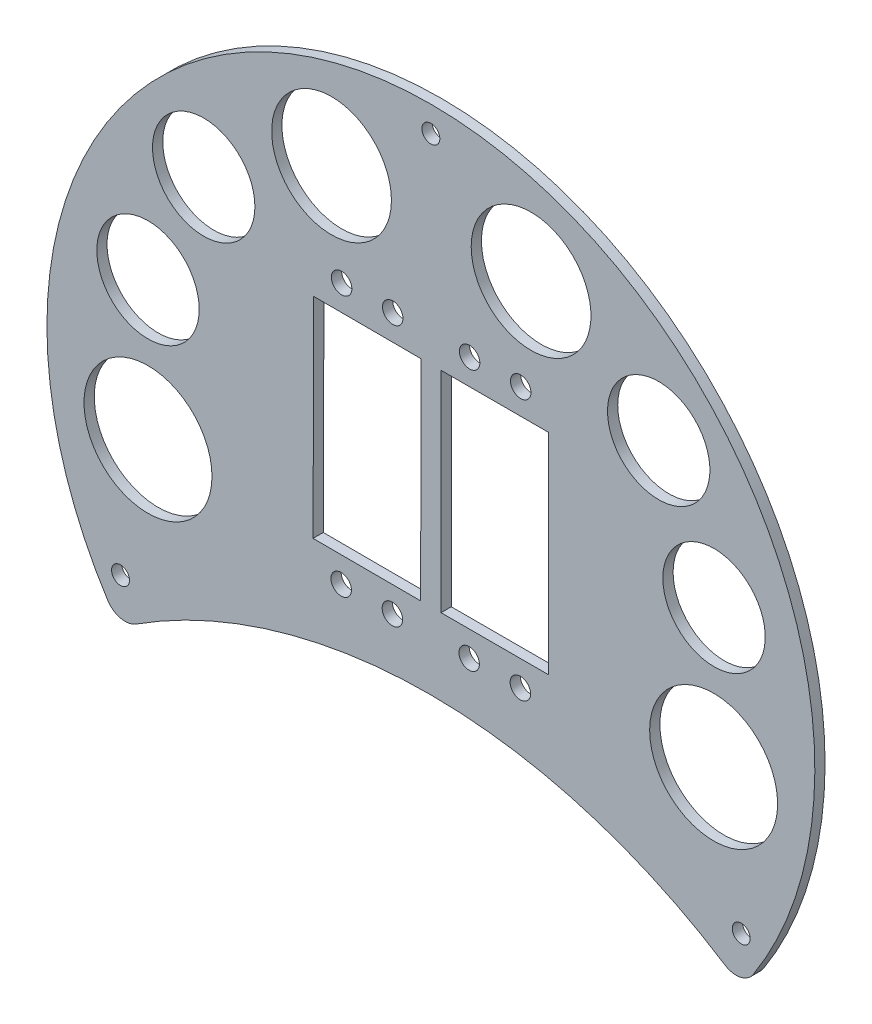
ISO-10303-21;
HEADER;
FILE_DESCRIPTION(('STEP AP214'),'2;1');
FILE_NAME('part.step','',(''),(''),'','','');
FILE_SCHEMA(('AUTOMOTIVE_DESIGN { 1 0 10303 214 1 1 1 1 }'));
ENDSEC;
DATA;
#1=APPLICATION_CONTEXT('core data for automotive mechanical design processes');
#2=APPLICATION_PROTOCOL_DEFINITION('international standard','automotive_design',2000,#1);
#3=PRODUCT_CONTEXT('',#1,'mechanical');
#4=PRODUCT('Part','Part','',(#3));
#5=PRODUCT_RELATED_PRODUCT_CATEGORY('part','',(#4));
#6=PRODUCT_DEFINITION_FORMATION('','',#4);
#7=PRODUCT_DEFINITION_CONTEXT('part definition',#1,'design');
#8=PRODUCT_DEFINITION('design','',#6,#7);
#9=PRODUCT_DEFINITION_SHAPE('','',#8);
#10=(LENGTH_UNIT() NAMED_UNIT(*) SI_UNIT(.MILLI.,.METRE.));
#11=(NAMED_UNIT(*) PLANE_ANGLE_UNIT() SI_UNIT($,.RADIAN.));
#12=(NAMED_UNIT(*) SI_UNIT($,.STERADIAN.) SOLID_ANGLE_UNIT());
#13=UNCERTAINTY_MEASURE_WITH_UNIT(LENGTH_MEASURE(1.E-05),#10,'distance_accuracy_value','');
#14=(GEOMETRIC_REPRESENTATION_CONTEXT(3) GLOBAL_UNCERTAINTY_ASSIGNED_CONTEXT((#13)) GLOBAL_UNIT_ASSIGNED_CONTEXT((#10,
#11,#12)) REPRESENTATION_CONTEXT('',''));
#15=CARTESIAN_POINT('',(0.,0.,0.));
#16=DIRECTION('',(0.,0.,1.));
#17=DIRECTION('',(1.,0.,0.));
#18=AXIS2_PLACEMENT_3D('',#15,#16,#17);
#19=CARTESIAN_POINT('',(-0.0987429554995067,-65.6598623126236,2.));
#20=DIRECTION('',(0.,0.,-1.));
#21=DIRECTION('',(-1.,0.,0.));
#22=AXIS2_PLACEMENT_3D('',#19,#20,#21);
#23=PLANE('',#22);
#24=CARTESIAN_POINT('',(17.4774003218336,-15.0409827319242,2.));
#25=DIRECTION('',(0.,0.,1.));
#26=DIRECTION('',(1.,0.,0.));
#27=AXIS2_PLACEMENT_3D('',#24,#25,#26);
#28=CIRCLE('',#27,2.);
#29=CARTESIAN_POINT('',(19.4774003218336,-15.0409827319242,2.));
#30=VERTEX_POINT('',#29);
#31=EDGE_CURVE('E404',#30,#30,#28,.T.);
#32=ORIENTED_EDGE('',*,*,#31,.F.);
#33=EDGE_LOOP('',(#32));
#34=FACE_BOUND('',#33,.T.);
#35=CARTESIAN_POINT('',(7.56186671963432,35.9740324724245,2.));
#36=DIRECTION('',(0.,0.,1.));
#37=DIRECTION('',(1.,0.,0.));
#38=AXIS2_PLACEMENT_3D('',#35,#36,#37);
#39=CIRCLE('',#38,2.00000000000208);
#40=CARTESIAN_POINT('',(9.5618667196364,35.9740324724245,2.));
#41=VERTEX_POINT('',#40);
#42=EDGE_CURVE('E151',#41,#41,#39,.F.);
#43=ORIENTED_EDGE('',*,*,#42,.T.);
#44=EDGE_LOOP('',(#43));
#45=FACE_BOUND('',#44,.T.);
#46=DIRECTION('',(-0.00300770451557121,-0.999995476846544,0.));
#47=VECTOR('',#46,1.);
#48=CARTESIAN_POINT('',(-1.98490496810612,0.00597003463893531,2.));
#49=LINE('',#48,#47);
#50=CARTESIAN_POINT('',(-1.89178939207128,30.9648472703288,2.));
#51=VERTEX_POINT('',#50);
#52=CARTESIAN_POINT('',(-2.0151052772097,-10.0349672803795,2.));
#53=VERTEX_POINT('',#52);
#54=EDGE_CURVE('E78',#51,#53,#49,.T.);
#55=ORIENTED_EDGE('',*,*,#54,.T.);
#56=DIRECTION('',(-0.999995476846544,0.00300770451557127,0.));
#57=VECTOR('',#56,1.);
#58=CARTESIAN_POINT('',(-0.0302003091035815,-10.0409373150184,2.));
#59=LINE('',#58,#57);
#60=CARTESIAN_POINT('',(-23.0150102909871,-9.97180548555249,2.));
#61=VERTEX_POINT('',#60);
#62=EDGE_CURVE('E189',#53,#61,#59,.T.);
#63=ORIENTED_EDGE('',*,*,#62,.T.);
#64=DIRECTION('',(-0.00300770451557121,-0.999995476846544,0.));
#65=VECTOR('',#64,1.);
#66=CARTESIAN_POINT('',(-22.9848099818835,0.0691318294659308,2.));
#67=LINE('',#66,#65);
#68=CARTESIAN_POINT('',(-22.8916944058487,31.0280090651558,2.));
#69=VERTEX_POINT('',#68);
#70=EDGE_CURVE('E185',#69,#61,#67,.T.);
#71=ORIENTED_EDGE('',*,*,#70,.F.);
#72=DIRECTION('',(-0.999995476846544,0.00300770451557119,0.));
#73=VECTOR('',#72,1.);
#74=CARTESIAN_POINT('',(0.0931155760348381,30.9588772356899,2.));
#75=LINE('',#74,#73);
#76=EDGE_CURVE('E172',#51,#69,#75,.T.);
#77=ORIENTED_EDGE('',*,*,#76,.F.);
#78=EDGE_LOOP('',(#55,#63,#71,#77));
#79=FACE_BOUND('',#78,.T.);
#80=CARTESIAN_POINT('',(55.2306988549599,-9.53210745779192,2.));
#81=DIRECTION('',(0.,0.,1.));
#82=DIRECTION('',(-1.,0.,0.));
#83=AXIS2_PLACEMENT_3D('',#80,#81,#82);
#84=CIRCLE('',#83,12.5);
#85=CARTESIAN_POINT('',(42.7306988549599,-9.53210745779192,2.));
#86=VERTEX_POINT('',#85);
#87=EDGE_CURVE('E209',#86,#86,#84,.T.);
#88=ORIENTED_EDGE('',*,*,#87,.F.);
#89=EDGE_LOOP('',(#88));
#90=FACE_BOUND('',#89,.T.);
#91=CARTESIAN_POINT('',(-55.2591188006772,17.6479430745857,2.));
#92=DIRECTION('',(0.,0.,1.));
#93=DIRECTION('',(1.,0.,0.));
#94=AXIS2_PLACEMENT_3D('',#91,#92,#93);
#95=CIRCLE('',#94,10.);
#96=CARTESIAN_POINT('',(-45.2591188006772,17.6479430745857,2.));
#97=VERTEX_POINT('',#96);
#98=EDGE_CURVE('E235',#97,#97,#95,.T.);
#99=ORIENTED_EDGE('',*,*,#98,.F.);
#100=EDGE_LOOP('',(#99));
#101=FACE_BOUND('',#100,.T.);
#102=CARTESIAN_POINT('',(-55.2591188006772,-9.36594672026292,2.));
#103=DIRECTION('',(0.,0.,1.));
#104=DIRECTION('',(1.,0.,0.));
#105=AXIS2_PLACEMENT_3D('',#102,#103,#104);
#106=CIRCLE('',#105,12.5);
#107=CARTESIAN_POINT('',(-42.7591188006772,-9.36594672026292,2.));
#108=VERTEX_POINT('',#107);
#109=EDGE_CURVE('E234',#108,#108,#106,.T.);
#110=ORIENTED_EDGE('',*,*,#109,.F.);
#111=EDGE_LOOP('',(#110));
#112=FACE_BOUND('',#111,.T.);
#113=CARTESIAN_POINT('',(-44.3754777327143,40.4603703322555,2.));
#114=DIRECTION('',(0.,0.,1.));
#115=DIRECTION('',(1.,0.,0.));
#116=AXIS2_PLACEMENT_3D('',#113,#114,#115);
#117=CIRCLE('',#116,10.);
#118=CARTESIAN_POINT('',(-34.3754777327143,40.4603703322555,2.));
#119=VERTEX_POINT('',#118);
#120=EDGE_CURVE('E251',#119,#119,#117,.T.);
#121=ORIENTED_EDGE('',*,*,#120,.F.);
#122=EDGE_LOOP('',(#121));
#123=FACE_BOUND('',#122,.T.);
#124=CARTESIAN_POINT('',(55.311948653279,17.4816601490877,2.));
#125=DIRECTION('',(0.,0.,1.));
#126=DIRECTION('',(-1.,0.,0.));
#127=AXIS2_PLACEMENT_3D('',#124,#125,#126);
#128=CIRCLE('',#127,10.);
#129=CARTESIAN_POINT('',(45.311948653279,17.4816601490877,2.));
#130=VERTEX_POINT('',#129);
#131=EDGE_CURVE('E210',#130,#130,#128,.T.);
#132=ORIENTED_EDGE('',*,*,#131,.F.);
#133=EDGE_LOOP('',(#132));
#134=FACE_BOUND('',#133,.T.);
#135=CARTESIAN_POINT('',(44.4969698541689,40.3267189990343,2.));
#136=DIRECTION('',(0.,0.,1.));
#137=DIRECTION('',(-1.,0.,0.));
#138=AXIS2_PLACEMENT_3D('',#135,#136,#137);
#139=CIRCLE('',#138,10.);
#140=CARTESIAN_POINT('',(34.4969698541689,40.3267189990343,2.));
#141=VERTEX_POINT('',#140);
#142=EDGE_CURVE('E218',#141,#141,#139,.T.);
#143=ORIENTED_EDGE('',*,*,#142,.F.);
#144=EDGE_LOOP('',(#143));
#145=FACE_BOUND('',#144,.T.);
#146=CARTESIAN_POINT('',(19.5694490750945,54.8142071950898,2.));
#147=DIRECTION('',(0.,0.,1.));
#148=DIRECTION('',(-1.,0.,0.));
#149=AXIS2_PLACEMENT_3D('',#146,#147,#148);
#150=CIRCLE('',#149,11.69783551895);
#151=CARTESIAN_POINT('',(7.87161355614443,54.8142071950898,2.));
#152=VERTEX_POINT('',#151);
#153=EDGE_CURVE('E226',#152,#152,#150,.T.);
#154=ORIENTED_EDGE('',*,*,#153,.F.);
#155=EDGE_LOOP('',(#154));
#156=FACE_BOUND('',#155,.T.);
#157=CARTESIAN_POINT('',(-19.4044956209751,54.8728183823695,2.));
#158=DIRECTION('',(0.,0.,1.));
#159=DIRECTION('',(1.,0.,0.));
#160=AXIS2_PLACEMENT_3D('',#157,#158,#159);
#161=CIRCLE('',#160,11.69783551895);
#162=CARTESIAN_POINT('',(-7.70666010202509,54.8728183823695,2.));
#163=VERTEX_POINT('',#162);
#164=EDGE_CURVE('E250',#163,#163,#161,.T.);
#165=ORIENTED_EDGE('',*,*,#164,.F.);
#166=EDGE_LOOP('',(#165));
#167=FACE_BOUND('',#166,.T.);
#168=CARTESIAN_POINT('',(0.,70.,2.));
#169=DIRECTION('',(0.,0.,1.));
#170=DIRECTION('',(1.,0.,0.));
#171=AXIS2_PLACEMENT_3D('',#168,#169,#170);
#172=CIRCLE('',#171,1.75);
#173=CARTESIAN_POINT('',(1.75,70.,2.));
#174=VERTEX_POINT('',#173);
#175=EDGE_CURVE('E275',#174,#174,#172,.T.);
#176=ORIENTED_EDGE('',*,*,#175,.F.);
#177=EDGE_LOOP('',(#176));
#178=FACE_BOUND('',#177,.T.);
#179=CARTESIAN_POINT('',(60.6217782649137,-34.9999999999983,2.));
#180=DIRECTION('',(0.,0.,1.));
#181=DIRECTION('',(1.,0.,0.));
#182=AXIS2_PLACEMENT_3D('',#179,#180,#181);
#183=CIRCLE('',#182,1.74999999999999);
#184=CARTESIAN_POINT('',(62.3717782649137,-34.9999999999983,2.));
#185=VERTEX_POINT('',#184);
#186=EDGE_CURVE('E283',#185,#185,#183,.T.);
#187=ORIENTED_EDGE('',*,*,#186,.F.);
#188=EDGE_LOOP('',(#187));
#189=FACE_BOUND('',#188,.T.);
#190=CARTESIAN_POINT('',(-60.6217782649077,-35.0000000000018,2.));
#191=DIRECTION('',(0.,0.,1.));
#192=DIRECTION('',(1.,0.,0.));
#193=AXIS2_PLACEMENT_3D('',#190,#191,#192);
#194=CIRCLE('',#193,1.75);
#195=CARTESIAN_POINT('',(-58.8717782649077,-35.0000000000018,2.));
#196=VERTEX_POINT('',#195);
#197=EDGE_CURVE('E266',#196,#196,#194,.T.);
#198=ORIENTED_EDGE('',*,*,#197,.F.);
#199=EDGE_LOOP('',(#198));
#200=FACE_BOUND('',#199,.T.);
#201=CARTESIAN_POINT('',(-0.197485910999013,-131.319724625247,2.));
#202=DIRECTION('',(0.,0.,-1.));
#203=DIRECTION('',(-1.,0.,0.));
#204=AXIS2_PLACEMENT_3D('',#201,#202,#203);
#205=CIRCLE('',#204,106.376248591032);
#206=CARTESIAN_POINT('',(-57.576659184096,-41.7455277893448,2.));
#207=VERTEX_POINT('',#206);
#208=CARTESIAN_POINT('',(57.4508405435942,-41.9185125457361,2.));
#209=VERTEX_POINT('',#208);
#210=EDGE_CURVE('E294',#207,#209,#205,.T.);
#211=ORIENTED_EDGE('',*,*,#210,.T.);
#212=CARTESIAN_POINT('',(59.6185547549206,-38.556814299609,2.));
#213=DIRECTION('',(0.,0.,-1.));
#214=DIRECTION('',(-1.,0.,0.));
#215=AXIS2_PLACEMENT_3D('',#212,#213,#214);
#216=CIRCLE('',#215,4.);
#217=CARTESIAN_POINT('',(62.9773465720992,-40.7290291897278,2.));
#218=VERTEX_POINT('',#217);
#219=EDGE_CURVE('E332',#209,#218,#216,.F.);
#220=ORIENTED_EDGE('',*,*,#219,.T.);
#221=CARTESIAN_POINT('',(0.,0.,2.));
#222=DIRECTION('',(0.,0.,1.));
#223=DIRECTION('',(1.,0.,0.));
#224=AXIS2_PLACEMENT_3D('',#221,#222,#223);
#225=CIRCLE('',#224,75.);
#226=CARTESIAN_POINT('',(-63.0995626009052,-40.5394277164151,2.));
#227=VERTEX_POINT('',#226);
#228=EDGE_CURVE('E298',#218,#227,#225,.T.);
#229=ORIENTED_EDGE('',*,*,#228,.T.);
#230=CARTESIAN_POINT('',(-59.7342525955236,-38.3773249048729,2.));
#231=DIRECTION('',(0.,0.,-1.));
#232=DIRECTION('',(-1.,0.,0.));
#233=AXIS2_PLACEMENT_3D('',#230,#231,#232);
#234=CIRCLE('',#233,4.);
#235=EDGE_CURVE('E329',#227,#207,#234,.F.);
#236=ORIENTED_EDGE('',*,*,#235,.T.);
#237=EDGE_LOOP('',(#211,#220,#229,#236));
#238=FACE_BOUND('',#237,.T.);
#239=CARTESIAN_POINT('',(-7.52257140844136,-15.003386382966,2.));
#240=DIRECTION('',(0.,0.,1.));
#241=DIRECTION('',(1.,0.,0.));
#242=AXIS2_PLACEMENT_3D('',#239,#240,#241);
#243=CIRCLE('',#242,2.);
#244=CARTESIAN_POINT('',(-5.52257140844136,-15.003386382966,2.));
#245=VERTEX_POINT('',#244);
#246=EDGE_CURVE('E405',#245,#245,#243,.T.);
#247=ORIENTED_EDGE('',*,*,#246,.F.);
#248=EDGE_LOOP('',(#247));
#249=FACE_BOUND('',#248,.T.);
#250=CARTESIAN_POINT('',(-7.45363325624011,35.996613617034,2.));
#251=DIRECTION('',(0.,0.,1.));
#252=DIRECTION('',(1.,0.,0.));
#253=AXIS2_PLACEMENT_3D('',#250,#251,#252);
#254=CIRCLE('',#253,1.99999999999792);
#255=CARTESIAN_POINT('',(-5.45363325624219,35.996613617034,2.));
#256=VERTEX_POINT('',#255);
#257=EDGE_CURVE('E419',#256,#256,#254,.T.);
#258=ORIENTED_EDGE('',*,*,#257,.F.);
#259=EDGE_LOOP('',(#258));
#260=FACE_BOUND('',#259,.T.);
#261=CARTESIAN_POINT('',(17.5463384740348,35.9590172680758,2.));
#262=DIRECTION('',(0.,0.,1.));
#263=DIRECTION('',(1.,0.,0.));
#264=AXIS2_PLACEMENT_3D('',#261,#262,#263);
#265=CIRCLE('',#264,1.99999999999792);
#266=CARTESIAN_POINT('',(19.5463384740327,35.9590172680758,2.));
#267=VERTEX_POINT('',#266);
#268=EDGE_CURVE('E180',#267,#267,#265,.T.);
#269=ORIENTED_EDGE('',*,*,#268,.F.);
#270=EDGE_LOOP('',(#269));
#271=FACE_BOUND('',#270,.T.);
#272=DIRECTION('',(0.,-1.,0.));
#273=VECTOR('',#272,1.);
#274=CARTESIAN_POINT('',(22.9849139461765,0.,2.));
#275=LINE('',#274,#273);
#276=CARTESIAN_POINT('',(22.9849139461765,30.9590172680758,2.));
#277=VERTEX_POINT('',#276);
#278=CARTESIAN_POINT('',(22.9849139461765,-10.0409827319242,2.));
#279=VERTEX_POINT('',#278);
#280=EDGE_CURVE('E70',#277,#279,#275,.T.);
#281=ORIENTED_EDGE('',*,*,#280,.T.);
#282=DIRECTION('',(1.,0.,0.));
#283=VECTOR('',#282,1.);
#284=CARTESIAN_POINT('',(0.,-10.0409827319242,2.));
#285=LINE('',#284,#283);
#286=CARTESIAN_POINT('',(1.9849139461765,-10.0409827319242,2.));
#287=VERTEX_POINT('',#286);
#288=EDGE_CURVE('E154',#287,#279,#285,.T.);
#289=ORIENTED_EDGE('',*,*,#288,.F.);
#290=DIRECTION('',(0.,-1.,0.));
#291=VECTOR('',#290,1.);
#292=CARTESIAN_POINT('',(1.9849139461765,0.,2.));
#293=LINE('',#292,#291);
#294=CARTESIAN_POINT('',(1.9849139461765,30.9590172680758,2.));
#295=VERTEX_POINT('',#294);
#296=EDGE_CURVE('E161',#295,#287,#293,.T.);
#297=ORIENTED_EDGE('',*,*,#296,.F.);
#298=DIRECTION('',(1.,0.,0.));
#299=VECTOR('',#298,1.);
#300=CARTESIAN_POINT('',(0.,30.9590172680758,2.));
#301=LINE('',#300,#299);
#302=EDGE_CURVE('E167',#295,#277,#301,.T.);
#303=ORIENTED_EDGE('',*,*,#302,.T.);
#304=EDGE_LOOP('',(#281,#289,#297,#303));
#305=FACE_BOUND('',#304,.T.);
#306=CARTESIAN_POINT('',(-17.4381050106406,36.0116288213827,2.));
#307=DIRECTION('',(0.,0.,1.));
#308=DIRECTION('',(1.,0.,0.));
#309=AXIS2_PLACEMENT_3D('',#306,#307,#308);
#310=CIRCLE('',#309,2.00000000000209);
#311=CARTESIAN_POINT('',(-15.4381050106385,36.0116288213827,2.));
#312=VERTEX_POINT('',#311);
#313=EDGE_CURVE('E423',#312,#312,#310,.F.);
#314=ORIENTED_EDGE('',*,*,#313,.T.);
#315=EDGE_LOOP('',(#314));
#316=FACE_BOUND('',#315,.T.);
#317=CARTESIAN_POINT('',(-17.5225601005513,-14.9883478433827,2.));
#318=DIRECTION('',(0.,0.,1.));
#319=DIRECTION('',(1.,0.,0.));
#320=AXIS2_PLACEMENT_3D('',#317,#318,#319);
#321=CIRCLE('',#320,2.);
#322=CARTESIAN_POINT('',(-15.5225601005513,-14.9883478433827,2.));
#323=VERTEX_POINT('',#322);
#324=EDGE_CURVE('E409',#323,#323,#321,.F.);
#325=ORIENTED_EDGE('',*,*,#324,.T.);
#326=EDGE_LOOP('',(#325));
#327=FACE_BOUND('',#326,.T.);
#328=CARTESIAN_POINT('',(7.47741162972359,-15.0259441923409,2.));
#329=DIRECTION('',(0.,0.,1.));
#330=DIRECTION('',(1.,0.,0.));
#331=AXIS2_PLACEMENT_3D('',#328,#329,#330);
#332=CIRCLE('',#331,2.);
#333=CARTESIAN_POINT('',(9.47741162972359,-15.0259441923409,2.));
#334=VERTEX_POINT('',#333);
#335=EDGE_CURVE('E401',#334,#334,#332,.F.);
#336=ORIENTED_EDGE('',*,*,#335,.T.);
#337=EDGE_LOOP('',(#336));
#338=FACE_BOUND('',#337,.T.);
#339=ADVANCED_FACE('F52',(#34,#45,#79,#90,#101,#112,#123,#134,#145,#156,#167,#178,#189,#200,
#238,#249,#260,#271,#305,#316,#327,#338),#23,.F.);
#340=CARTESIAN_POINT('',(-0.0987429554995067,-65.6598623126236,0.));
#341=DIRECTION('',(0.,0.,-1.));
#342=DIRECTION('',(-1.,0.,0.));
#343=AXIS2_PLACEMENT_3D('',#340,#341,#342);
#344=PLANE('',#343);
#345=CARTESIAN_POINT('',(-17.5225601005513,-14.9883478433827,0.));
#346=DIRECTION('',(0.,0.,-1.));
#347=DIRECTION('',(-1.,0.,0.));
#348=AXIS2_PLACEMENT_3D('',#345,#346,#347);
#349=CIRCLE('',#348,2.);
#350=CARTESIAN_POINT('',(-19.5225601005513,-14.9883478433827,0.));
#351=VERTEX_POINT('',#350);
#352=EDGE_CURVE('E379',#351,#351,#349,.F.);
#353=ORIENTED_EDGE('',*,*,#352,.T.);
#354=EDGE_LOOP('',(#353));
#355=FACE_BOUND('',#354,.T.);
#356=DIRECTION('',(-1.,0.,0.));
#357=VECTOR('',#356,1.);
#358=CARTESIAN_POINT('',(-0.0987429554995159,-10.0409827319242,0.));
#359=LINE('',#358,#357);
#360=CARTESIAN_POINT('',(22.9849139461765,-10.0409827319242,0.));
#361=VERTEX_POINT('',#360);
#362=CARTESIAN_POINT('',(1.9849139461765,-10.0409827319242,0.));
#363=VERTEX_POINT('',#362);
#364=EDGE_CURVE('E62',#361,#363,#359,.T.);
#365=ORIENTED_EDGE('',*,*,#364,.F.);
#366=DIRECTION('',(0.,1.,0.));
#367=VECTOR('',#366,1.);
#368=CARTESIAN_POINT('',(22.9849139461765,-65.6598623126236,0.));
#369=LINE('',#368,#367);
#370=CARTESIAN_POINT('',(22.9849139461765,30.9590172680758,0.));
#371=VERTEX_POINT('',#370);
#372=EDGE_CURVE('E12',#361,#371,#369,.T.);
#373=ORIENTED_EDGE('',*,*,#372,.T.);
#374=DIRECTION('',(-1.,0.,0.));
#375=VECTOR('',#374,1.);
#376=CARTESIAN_POINT('',(-0.0987429554995227,30.9590172680758,0.));
#377=LINE('',#376,#375);
#378=CARTESIAN_POINT('',(1.9849139461765,30.9590172680758,0.));
#379=VERTEX_POINT('',#378);
#380=EDGE_CURVE('E350',#371,#379,#377,.T.);
#381=ORIENTED_EDGE('',*,*,#380,.T.);
#382=DIRECTION('',(0.,1.,0.));
#383=VECTOR('',#382,1.);
#384=CARTESIAN_POINT('',(1.98491394617651,-65.6598623126236,0.));
#385=LINE('',#384,#383);
#386=EDGE_CURVE('E370',#363,#379,#385,.T.);
#387=ORIENTED_EDGE('',*,*,#386,.F.);
#388=EDGE_LOOP('',(#365,#373,#381,#387));
#389=FACE_BOUND('',#388,.T.);
#390=CARTESIAN_POINT('',(7.56186671963432,35.9740324724245,0.));
#391=DIRECTION('',(0.,0.,-1.));
#392=DIRECTION('',(-1.,0.,0.));
#393=AXIS2_PLACEMENT_3D('',#390,#391,#392);
#394=CIRCLE('',#393,2.00000000000208);
#395=CARTESIAN_POINT('',(5.56186671963224,35.9740324724245,0.));
#396=VERTEX_POINT('',#395);
#397=EDGE_CURVE('E362',#396,#396,#394,.F.);
#398=ORIENTED_EDGE('',*,*,#397,.T.);
#399=EDGE_LOOP('',(#398));
#400=FACE_BOUND('',#399,.T.);
#401=CARTESIAN_POINT('',(17.5463384740348,35.9590172680758,0.));
#402=DIRECTION('',(0.,0.,-1.));
#403=DIRECTION('',(-1.,0.,0.));
#404=AXIS2_PLACEMENT_3D('',#401,#402,#403);
#405=CIRCLE('',#404,1.99999999999792);
#406=CARTESIAN_POINT('',(15.5463384740369,35.9590172680758,0.));
#407=VERTEX_POINT('',#406);
#408=EDGE_CURVE('E358',#407,#407,#405,.T.);
#409=ORIENTED_EDGE('',*,*,#408,.F.);
#410=EDGE_LOOP('',(#409));
#411=FACE_BOUND('',#410,.T.);
#412=CARTESIAN_POINT('',(-7.45363325624011,35.996613617034,0.));
#413=DIRECTION('',(0.,0.,-1.));
#414=DIRECTION('',(-1.,0.,0.));
#415=AXIS2_PLACEMENT_3D('',#412,#413,#414);
#416=CIRCLE('',#415,1.99999999999792);
#417=CARTESIAN_POINT('',(-9.45363325623803,35.996613617034,0.));
#418=VERTEX_POINT('',#417);
#419=EDGE_CURVE('E354',#418,#418,#416,.T.);
#420=ORIENTED_EDGE('',*,*,#419,.F.);
#421=EDGE_LOOP('',(#420));
#422=FACE_BOUND('',#421,.T.);
#423=CARTESIAN_POINT('',(-7.52257140844136,-15.003386382966,0.));
#424=DIRECTION('',(0.,0.,-1.));
#425=DIRECTION('',(-1.,0.,0.));
#426=AXIS2_PLACEMENT_3D('',#423,#424,#425);
#427=CIRCLE('',#426,2.);
#428=CARTESIAN_POINT('',(-9.52257140844136,-15.003386382966,0.));
#429=VERTEX_POINT('',#428);
#430=EDGE_CURVE('E197',#429,#429,#427,.T.);
#431=ORIENTED_EDGE('',*,*,#430,.F.);
#432=EDGE_LOOP('',(#431));
#433=FACE_BOUND('',#432,.T.);
#434=CARTESIAN_POINT('',(55.2306988549599,-9.53210745779192,0.));
#435=DIRECTION('',(0.,0.,1.));
#436=DIRECTION('',(-1.,0.,0.));
#437=AXIS2_PLACEMENT_3D('',#434,#435,#436);
#438=CIRCLE('',#437,12.5);
#439=CARTESIAN_POINT('',(42.7306988549599,-9.53210745779192,0.));
#440=VERTEX_POINT('',#439);
#441=EDGE_CURVE('E239',#440,#440,#438,.T.);
#442=ORIENTED_EDGE('',*,*,#441,.T.);
#443=EDGE_LOOP('',(#442));
#444=FACE_BOUND('',#443,.T.);
#445=CARTESIAN_POINT('',(-55.2591188006772,17.6479430745857,0.));
#446=DIRECTION('',(0.,0.,1.));
#447=DIRECTION('',(1.,0.,0.));
#448=AXIS2_PLACEMENT_3D('',#445,#446,#447);
#449=CIRCLE('',#448,10.);
#450=CARTESIAN_POINT('',(-45.2591188006772,17.6479430745857,0.));
#451=VERTEX_POINT('',#450);
#452=EDGE_CURVE('E230',#451,#451,#449,.T.);
#453=ORIENTED_EDGE('',*,*,#452,.T.);
#454=EDGE_LOOP('',(#453));
#455=FACE_BOUND('',#454,.T.);
#456=CARTESIAN_POINT('',(-55.2591188006772,-9.36594672026292,0.));
#457=DIRECTION('',(0.,0.,1.));
#458=DIRECTION('',(1.,0.,0.));
#459=AXIS2_PLACEMENT_3D('',#456,#457,#458);
#460=CIRCLE('',#459,12.5);
#461=CARTESIAN_POINT('',(-42.7591188006772,-9.36594672026292,0.));
#462=VERTEX_POINT('',#461);
#463=EDGE_CURVE('E255',#462,#462,#460,.T.);
#464=ORIENTED_EDGE('',*,*,#463,.T.);
#465=EDGE_LOOP('',(#464));
#466=FACE_BOUND('',#465,.T.);
#467=CARTESIAN_POINT('',(-44.3754777327143,40.4603703322555,0.));
#468=DIRECTION('',(0.,0.,1.));
#469=DIRECTION('',(1.,0.,0.));
#470=AXIS2_PLACEMENT_3D('',#467,#468,#469);
#471=CIRCLE('',#470,10.);
#472=CARTESIAN_POINT('',(-34.3754777327143,40.4603703322555,0.));
#473=VERTEX_POINT('',#472);
#474=EDGE_CURVE('E246',#473,#473,#471,.T.);
#475=ORIENTED_EDGE('',*,*,#474,.T.);
#476=EDGE_LOOP('',(#475));
#477=FACE_BOUND('',#476,.T.);
#478=CARTESIAN_POINT('',(55.311948653279,17.4816601490877,0.));
#479=DIRECTION('',(0.,0.,1.));
#480=DIRECTION('',(-1.,0.,0.));
#481=AXIS2_PLACEMENT_3D('',#478,#479,#480);
#482=CIRCLE('',#481,10.);
#483=CARTESIAN_POINT('',(45.311948653279,17.4816601490877,0.));
#484=VERTEX_POINT('',#483);
#485=EDGE_CURVE('E205',#484,#484,#482,.T.);
#486=ORIENTED_EDGE('',*,*,#485,.T.);
#487=EDGE_LOOP('',(#486));
#488=FACE_BOUND('',#487,.T.);
#489=CARTESIAN_POINT('',(44.4969698541689,40.3267189990343,0.));
#490=DIRECTION('',(0.,0.,1.));
#491=DIRECTION('',(-1.,0.,0.));
#492=AXIS2_PLACEMENT_3D('',#489,#490,#491);
#493=CIRCLE('',#492,10.);
#494=CARTESIAN_POINT('',(34.4969698541689,40.3267189990343,0.));
#495=VERTEX_POINT('',#494);
#496=EDGE_CURVE('E214',#495,#495,#493,.T.);
#497=ORIENTED_EDGE('',*,*,#496,.T.);
#498=EDGE_LOOP('',(#497));
#499=FACE_BOUND('',#498,.T.);
#500=CARTESIAN_POINT('',(19.5694490750945,54.8142071950898,0.));
#501=DIRECTION('',(0.,0.,1.));
#502=DIRECTION('',(-1.,0.,0.));
#503=AXIS2_PLACEMENT_3D('',#500,#501,#502);
#504=CIRCLE('',#503,11.69783551895);
#505=CARTESIAN_POINT('',(7.87161355614443,54.8142071950898,0.));
#506=VERTEX_POINT('',#505);
#507=EDGE_CURVE('E222',#506,#506,#504,.T.);
#508=ORIENTED_EDGE('',*,*,#507,.T.);
#509=EDGE_LOOP('',(#508));
#510=FACE_BOUND('',#509,.T.);
#511=CARTESIAN_POINT('',(-19.4044956209751,54.8728183823695,0.));
#512=DIRECTION('',(0.,0.,1.));
#513=DIRECTION('',(1.,0.,0.));
#514=AXIS2_PLACEMENT_3D('',#511,#512,#513);
#515=CIRCLE('',#514,11.69783551895);
#516=CARTESIAN_POINT('',(-7.70666010202509,54.8728183823695,0.));
#517=VERTEX_POINT('',#516);
#518=EDGE_CURVE('E262',#517,#517,#515,.T.);
#519=ORIENTED_EDGE('',*,*,#518,.T.);
#520=EDGE_LOOP('',(#519));
#521=FACE_BOUND('',#520,.T.);
#522=CARTESIAN_POINT('',(0.,70.,0.));
#523=DIRECTION('',(0.,0.,1.));
#524=DIRECTION('',(1.,0.,0.));
#525=AXIS2_PLACEMENT_3D('',#522,#523,#524);
#526=CIRCLE('',#525,1.75);
#527=CARTESIAN_POINT('',(1.75,70.,0.));
#528=VERTEX_POINT('',#527);
#529=EDGE_CURVE('E270',#528,#528,#526,.T.);
#530=ORIENTED_EDGE('',*,*,#529,.T.);
#531=EDGE_LOOP('',(#530));
#532=FACE_BOUND('',#531,.T.);
#533=CARTESIAN_POINT('',(60.6217782649137,-34.9999999999983,0.));
#534=DIRECTION('',(0.,0.,1.));
#535=DIRECTION('',(1.,0.,0.));
#536=AXIS2_PLACEMENT_3D('',#533,#534,#535);
#537=CIRCLE('',#536,1.74999999999999);
#538=CARTESIAN_POINT('',(62.3717782649137,-34.9999999999983,0.));
#539=VERTEX_POINT('',#538);
#540=EDGE_CURVE('E279',#539,#539,#537,.T.);
#541=ORIENTED_EDGE('',*,*,#540,.T.);
#542=EDGE_LOOP('',(#541));
#543=FACE_BOUND('',#542,.T.);
#544=CARTESIAN_POINT('',(-60.6217782649077,-35.0000000000018,0.));
#545=DIRECTION('',(0.,0.,1.));
#546=DIRECTION('',(1.,0.,0.));
#547=AXIS2_PLACEMENT_3D('',#544,#545,#546);
#548=CIRCLE('',#547,1.75);
#549=CARTESIAN_POINT('',(-58.8717782649077,-35.0000000000018,0.));
#550=VERTEX_POINT('',#549);
#551=EDGE_CURVE('E287',#550,#550,#548,.T.);
#552=ORIENTED_EDGE('',*,*,#551,.T.);
#553=EDGE_LOOP('',(#552));
#554=FACE_BOUND('',#553,.T.);
#555=CARTESIAN_POINT('',(0.,0.,0.));
#556=DIRECTION('',(0.,0.,1.));
#557=DIRECTION('',(1.,0.,0.));
#558=AXIS2_PLACEMENT_3D('',#555,#556,#557);
#559=CIRCLE('',#558,75.);
#560=CARTESIAN_POINT('',(62.9773465720992,-40.7290291897278,0.));
#561=VERTEX_POINT('',#560);
#562=CARTESIAN_POINT('',(-63.0995626009052,-40.5394277164151,0.));
#563=VERTEX_POINT('',#562);
#564=EDGE_CURVE('E299',#561,#563,#559,.T.);
#565=ORIENTED_EDGE('',*,*,#564,.F.);
#566=CARTESIAN_POINT('',(59.6185547549206,-38.556814299609,0.));
#567=DIRECTION('',(0.,0.,-1.));
#568=DIRECTION('',(-1.,0.,0.));
#569=AXIS2_PLACEMENT_3D('',#566,#567,#568);
#570=CIRCLE('',#569,4.);
#571=CARTESIAN_POINT('',(57.4508405435942,-41.9185125457361,0.));
#572=VERTEX_POINT('',#571);
#573=EDGE_CURVE('E319',#561,#572,#570,.T.);
#574=ORIENTED_EDGE('',*,*,#573,.T.);
#575=CARTESIAN_POINT('',(-0.197485910999013,-131.319724625247,0.));
#576=DIRECTION('',(0.,0.,-1.));
#577=DIRECTION('',(-1.,0.,0.));
#578=AXIS2_PLACEMENT_3D('',#575,#576,#577);
#579=CIRCLE('',#578,106.376248591032);
#580=CARTESIAN_POINT('',(-57.576659184096,-41.7455277893448,0.));
#581=VERTEX_POINT('',#580);
#582=EDGE_CURVE('E274',#581,#572,#579,.T.);
#583=ORIENTED_EDGE('',*,*,#582,.F.);
#584=CARTESIAN_POINT('',(-59.7342525955236,-38.3773249048729,0.));
#585=DIRECTION('',(0.,0.,-1.));
#586=DIRECTION('',(-1.,0.,0.));
#587=AXIS2_PLACEMENT_3D('',#584,#585,#586);
#588=CIRCLE('',#587,4.);
#589=EDGE_CURVE('E316',#581,#563,#588,.T.);
#590=ORIENTED_EDGE('',*,*,#589,.T.);
#591=EDGE_LOOP('',(#565,#574,#583,#590));
#592=FACE_BOUND('',#591,.T.);
#593=DIRECTION('',(0.999995476846544,-0.00300770451557127,0.));
#594=VECTOR('',#593,1.);
#595=CARTESIAN_POINT('',(0.0685421997663777,-10.0412343046516,0.));
#596=LINE('',#595,#594);
#597=CARTESIAN_POINT('',(-23.0150102909871,-9.97180548555249,0.));
#598=VERTEX_POINT('',#597);
#599=CARTESIAN_POINT('',(-2.0151052772097,-10.0349672803795,0.));
#600=VERTEX_POINT('',#599);
#601=EDGE_CURVE('E342',#598,#600,#596,.T.);
#602=ORIENTED_EDGE('',*,*,#601,.T.);
#603=DIRECTION('',(0.00300770451557121,0.999995476846544,0.));
#604=VECTOR('',#603,1.);
#605=CARTESIAN_POINT('',(-2.18239043247558,-65.6535952883515,0.));
#606=LINE('',#605,#604);
#607=CARTESIAN_POINT('',(-1.89178939207128,30.9648472703288,0.));
#608=VERTEX_POINT('',#607);
#609=EDGE_CURVE('E346',#600,#608,#606,.T.);
#610=ORIENTED_EDGE('',*,*,#609,.T.);
#611=DIRECTION('',(0.999995476846544,-0.00300770451557119,0.));
#612=VECTOR('',#611,1.);
#613=CARTESIAN_POINT('',(0.191858084904792,30.9585802460567,0.));
#614=LINE('',#613,#612);
#615=CARTESIAN_POINT('',(-22.8916944058487,31.0280090651558,0.));
#616=VERTEX_POINT('',#615);
#617=EDGE_CURVE('E335',#616,#608,#614,.T.);
#618=ORIENTED_EDGE('',*,*,#617,.F.);
#619=DIRECTION('',(0.00300770451557121,0.999995476846544,0.));
#620=VECTOR('',#619,1.);
#621=CARTESIAN_POINT('',(-23.182295446253,-65.5904334935245,0.));
#622=LINE('',#621,#620);
#623=EDGE_CURVE('E338',#598,#616,#622,.T.);
#624=ORIENTED_EDGE('',*,*,#623,.F.);
#625=EDGE_LOOP('',(#602,#610,#618,#624));
#626=FACE_BOUND('',#625,.T.);
#627=CARTESIAN_POINT('',(-17.4381050106406,36.0116288213827,0.));
#628=DIRECTION('',(0.,0.,-1.));
#629=DIRECTION('',(-1.,0.,0.));
#630=AXIS2_PLACEMENT_3D('',#627,#628,#629);
#631=CIRCLE('',#630,2.00000000000209);
#632=CARTESIAN_POINT('',(-19.4381050106427,36.0116288213827,0.));
#633=VERTEX_POINT('',#632);
#634=EDGE_CURVE('E366',#633,#633,#631,.F.);
#635=ORIENTED_EDGE('',*,*,#634,.T.);
#636=EDGE_LOOP('',(#635));
#637=FACE_BOUND('',#636,.T.);
#638=CARTESIAN_POINT('',(17.4774003218336,-15.0409827319242,0.));
#639=DIRECTION('',(0.,0.,-1.));
#640=DIRECTION('',(-1.,0.,0.));
#641=AXIS2_PLACEMENT_3D('',#638,#639,#640);
#642=CIRCLE('',#641,2.);
#643=CARTESIAN_POINT('',(15.4774003218336,-15.0409827319242,0.));
#644=VERTEX_POINT('',#643);
#645=EDGE_CURVE('E382',#644,#644,#642,.T.);
#646=ORIENTED_EDGE('',*,*,#645,.F.);
#647=EDGE_LOOP('',(#646));
#648=FACE_BOUND('',#647,.T.);
#649=CARTESIAN_POINT('',(7.47741162972359,-15.0259441923409,0.));
#650=DIRECTION('',(0.,0.,-1.));
#651=DIRECTION('',(-1.,0.,0.));
#652=AXIS2_PLACEMENT_3D('',#649,#650,#651);
#653=CIRCLE('',#652,2.);
#654=CARTESIAN_POINT('',(5.47741162972359,-15.0259441923409,0.));
#655=VERTEX_POINT('',#654);
#656=EDGE_CURVE('E56',#655,#655,#653,.F.);
#657=ORIENTED_EDGE('',*,*,#656,.T.);
#658=EDGE_LOOP('',(#657));
#659=FACE_BOUND('',#658,.T.);
#660=ADVANCED_FACE('F392',(#355,#389,#400,#411,#422,#433,#444,#455,#466,#477,#488,#499,#510,
#521,#532,#543,#554,#592,#626,#637,#648,#659),#344,.T.);
#661=CARTESIAN_POINT('',(-0.197485910999013,-131.319724625247,2.));
#662=DIRECTION('',(0.,0.,-1.));
#663=DIRECTION('',(-1.,0.,0.));
#664=AXIS2_PLACEMENT_3D('',#661,#662,#663);
#665=CYLINDRICAL_SURFACE('',#664,106.376248591032);
#666=ORIENTED_EDGE('',*,*,#582,.T.);
#667=DIRECTION('',(0.,0.,-1.));
#668=VECTOR('',#667,1.);
#669=CARTESIAN_POINT('',(57.4508405435942,-41.9185125457361,2.));
#670=LINE('',#669,#668);
#671=EDGE_CURVE('E326',#572,#209,#670,.F.);
#672=ORIENTED_EDGE('',*,*,#671,.T.);
#673=ORIENTED_EDGE('',*,*,#210,.F.);
#674=DIRECTION('',(0.,0.,-1.));
#675=VECTOR('',#674,1.);
#676=CARTESIAN_POINT('',(-57.576659184096,-41.7455277893448,2.));
#677=LINE('',#676,#675);
#678=EDGE_CURVE('E322',#207,#581,#677,.T.);
#679=ORIENTED_EDGE('',*,*,#678,.T.);
#680=EDGE_LOOP('',(#666,#672,#673,#679));
#681=FACE_BOUND('',#680,.T.);
#682=ADVANCED_FACE('F438',(#681),#665,.F.);
#683=CARTESIAN_POINT('',(0.,0.,2.));
#684=DIRECTION('',(0.,0.,-1.));
#685=DIRECTION('',(-1.,0.,0.));
#686=AXIS2_PLACEMENT_3D('',#683,#684,#685);
#687=CYLINDRICAL_SURFACE('',#686,75.);
#688=ORIENTED_EDGE('',*,*,#228,.F.);
#689=DIRECTION('',(0.,0.,-1.));
#690=VECTOR('',#689,1.);
#691=CARTESIAN_POINT('',(62.9773465720992,-40.7290291897278,2.));
#692=LINE('',#691,#690);
#693=EDGE_CURVE('E312',#218,#561,#692,.T.);
#694=ORIENTED_EDGE('',*,*,#693,.T.);
#695=ORIENTED_EDGE('',*,*,#564,.T.);
#696=DIRECTION('',(0.,0.,-1.));
#697=VECTOR('',#696,1.);
#698=CARTESIAN_POINT('',(-63.0995626009052,-40.5394277164151,2.));
#699=LINE('',#698,#697);
#700=EDGE_CURVE('E303',#563,#227,#699,.F.);
#701=ORIENTED_EDGE('',*,*,#700,.T.);
#702=EDGE_LOOP('',(#688,#694,#695,#701));
#703=FACE_BOUND('',#702,.T.);
#704=ADVANCED_FACE('F511',(#703),#687,.T.);
#705=CARTESIAN_POINT('',(-60.6217782649077,-35.0000000000018,0.));
#706=DIRECTION('',(0.,0.,1.));
#707=DIRECTION('',(1.,0.,0.));
#708=AXIS2_PLACEMENT_3D('',#705,#706,#707);
#709=CYLINDRICAL_SURFACE('',#708,1.75);
#710=ORIENTED_EDGE('',*,*,#551,.F.);
#711=EDGE_LOOP('',(#710));
#712=FACE_BOUND('',#711,.T.);
#713=ORIENTED_EDGE('',*,*,#197,.T.);
#714=EDGE_LOOP('',(#713));
#715=FACE_BOUND('',#714,.T.);
#716=ADVANCED_FACE('F508',(#712,#715),#709,.F.);
#717=CARTESIAN_POINT('',(60.6217782649137,-34.9999999999983,0.));
#718=DIRECTION('',(0.,0.,1.));
#719=DIRECTION('',(1.,0.,0.));
#720=AXIS2_PLACEMENT_3D('',#717,#718,#719);
#721=CYLINDRICAL_SURFACE('',#720,1.74999999999999);
#722=ORIENTED_EDGE('',*,*,#540,.F.);
#723=EDGE_LOOP('',(#722));
#724=FACE_BOUND('',#723,.T.);
#725=ORIENTED_EDGE('',*,*,#186,.T.);
#726=EDGE_LOOP('',(#725));
#727=FACE_BOUND('',#726,.T.);
#728=ADVANCED_FACE('F527',(#724,#727),#721,.F.);
#729=CARTESIAN_POINT('',(0.,70.,0.));
#730=DIRECTION('',(0.,0.,1.));
#731=DIRECTION('',(1.,0.,0.));
#732=AXIS2_PLACEMENT_3D('',#729,#730,#731);
#733=CYLINDRICAL_SURFACE('',#732,1.75);
#734=ORIENTED_EDGE('',*,*,#529,.F.);
#735=EDGE_LOOP('',(#734));
#736=FACE_BOUND('',#735,.T.);
#737=ORIENTED_EDGE('',*,*,#175,.T.);
#738=EDGE_LOOP('',(#737));
#739=FACE_BOUND('',#738,.T.);
#740=ADVANCED_FACE('F519',(#736,#739),#733,.F.);
#741=CARTESIAN_POINT('',(59.6185547549206,-38.556814299609,2.));
#742=DIRECTION('',(0.,0.,1.));
#743=DIRECTION('',(1.,0.,0.));
#744=AXIS2_PLACEMENT_3D('',#741,#742,#743);
#745=CYLINDRICAL_SURFACE('',#744,4.);
#746=ORIENTED_EDGE('',*,*,#219,.F.);
#747=ORIENTED_EDGE('',*,*,#671,.F.);
#748=ORIENTED_EDGE('',*,*,#573,.F.);
#749=ORIENTED_EDGE('',*,*,#693,.F.);
#750=EDGE_LOOP('',(#746,#747,#748,#749));
#751=FACE_BOUND('',#750,.T.);
#752=ADVANCED_FACE('F517',(#751),#745,.T.);
#753=CARTESIAN_POINT('',(-59.7342525955236,-38.3773249048729,2.));
#754=DIRECTION('',(0.,0.,1.));
#755=DIRECTION('',(1.,0.,0.));
#756=AXIS2_PLACEMENT_3D('',#753,#754,#755);
#757=CYLINDRICAL_SURFACE('',#756,4.);
#758=ORIENTED_EDGE('',*,*,#235,.F.);
#759=ORIENTED_EDGE('',*,*,#700,.F.);
#760=ORIENTED_EDGE('',*,*,#589,.F.);
#761=ORIENTED_EDGE('',*,*,#678,.F.);
#762=EDGE_LOOP('',(#758,#759,#760,#761));
#763=FACE_BOUND('',#762,.T.);
#764=ADVANCED_FACE('F54',(#763),#757,.T.);
#765=CARTESIAN_POINT('',(-19.4044956209751,54.8728183823695,0.));
#766=DIRECTION('',(0.,0.,1.));
#767=DIRECTION('',(1.,0.,0.));
#768=AXIS2_PLACEMENT_3D('',#765,#766,#767);
#769=CYLINDRICAL_SURFACE('',#768,11.69783551895);
#770=ORIENTED_EDGE('',*,*,#518,.F.);
#771=EDGE_LOOP('',(#770));
#772=FACE_BOUND('',#771,.T.);
#773=ORIENTED_EDGE('',*,*,#164,.T.);
#774=EDGE_LOOP('',(#773));
#775=FACE_BOUND('',#774,.T.);
#776=ADVANCED_FACE('F525',(#772,#775),#769,.F.);
#777=CARTESIAN_POINT('',(19.5694490750945,54.8142071950898,0.));
#778=DIRECTION('',(0.,0.,1.));
#779=DIRECTION('',(1.,0.,0.));
#780=AXIS2_PLACEMENT_3D('',#777,#778,#779);
#781=CYLINDRICAL_SURFACE('',#780,11.69783551895);
#782=ORIENTED_EDGE('',*,*,#507,.F.);
#783=EDGE_LOOP('',(#782));
#784=FACE_BOUND('',#783,.T.);
#785=ORIENTED_EDGE('',*,*,#153,.T.);
#786=EDGE_LOOP('',(#785));
#787=FACE_BOUND('',#786,.T.);
#788=ADVANCED_FACE('F595',(#784,#787),#781,.F.);
#789=CARTESIAN_POINT('',(44.4969698541689,40.3267189990343,0.));
#790=DIRECTION('',(0.,0.,1.));
#791=DIRECTION('',(1.,0.,0.));
#792=AXIS2_PLACEMENT_3D('',#789,#790,#791);
#793=CYLINDRICAL_SURFACE('',#792,10.);
#794=ORIENTED_EDGE('',*,*,#496,.F.);
#795=EDGE_LOOP('',(#794));
#796=FACE_BOUND('',#795,.T.);
#797=ORIENTED_EDGE('',*,*,#142,.T.);
#798=EDGE_LOOP('',(#797));
#799=FACE_BOUND('',#798,.T.);
#800=ADVANCED_FACE('F591',(#796,#799),#793,.F.);
#801=CARTESIAN_POINT('',(55.311948653279,17.4816601490877,0.));
#802=DIRECTION('',(0.,0.,1.));
#803=DIRECTION('',(1.,0.,0.));
#804=AXIS2_PLACEMENT_3D('',#801,#802,#803);
#805=CYLINDRICAL_SURFACE('',#804,10.);
#806=ORIENTED_EDGE('',*,*,#485,.F.);
#807=EDGE_LOOP('',(#806));
#808=FACE_BOUND('',#807,.T.);
#809=ORIENTED_EDGE('',*,*,#131,.T.);
#810=EDGE_LOOP('',(#809));
#811=FACE_BOUND('',#810,.T.);
#812=ADVANCED_FACE('F587',(#808,#811),#805,.F.);
#813=CARTESIAN_POINT('',(-44.3754777327143,40.4603703322555,0.));
#814=DIRECTION('',(0.,0.,1.));
#815=DIRECTION('',(1.,0.,0.));
#816=AXIS2_PLACEMENT_3D('',#813,#814,#815);
#817=CYLINDRICAL_SURFACE('',#816,10.);
#818=ORIENTED_EDGE('',*,*,#474,.F.);
#819=EDGE_LOOP('',(#818));
#820=FACE_BOUND('',#819,.T.);
#821=ORIENTED_EDGE('',*,*,#120,.T.);
#822=EDGE_LOOP('',(#821));
#823=FACE_BOUND('',#822,.T.);
#824=ADVANCED_FACE('F590',(#820,#823),#817,.F.);
#825=CARTESIAN_POINT('',(-55.2591188006772,-9.36594672026292,0.));
#826=DIRECTION('',(0.,0.,1.));
#827=DIRECTION('',(1.,0.,0.));
#828=AXIS2_PLACEMENT_3D('',#825,#826,#827);
#829=CYLINDRICAL_SURFACE('',#828,12.5);
#830=ORIENTED_EDGE('',*,*,#463,.F.);
#831=EDGE_LOOP('',(#830));
#832=FACE_BOUND('',#831,.T.);
#833=ORIENTED_EDGE('',*,*,#109,.T.);
#834=EDGE_LOOP('',(#833));
#835=FACE_BOUND('',#834,.T.);
#836=ADVANCED_FACE('F603',(#832,#835),#829,.F.);
#837=CARTESIAN_POINT('',(-55.2591188006772,17.6479430745857,0.));
#838=DIRECTION('',(0.,0.,1.));
#839=DIRECTION('',(1.,0.,0.));
#840=AXIS2_PLACEMENT_3D('',#837,#838,#839);
#841=CYLINDRICAL_SURFACE('',#840,10.);
#842=ORIENTED_EDGE('',*,*,#452,.F.);
#843=EDGE_LOOP('',(#842));
#844=FACE_BOUND('',#843,.T.);
#845=ORIENTED_EDGE('',*,*,#98,.T.);
#846=EDGE_LOOP('',(#845));
#847=FACE_BOUND('',#846,.T.);
#848=ADVANCED_FACE('F600',(#844,#847),#841,.F.);
#849=CARTESIAN_POINT('',(55.2306988549599,-9.53210745779192,0.));
#850=DIRECTION('',(0.,0.,1.));
#851=DIRECTION('',(1.,0.,0.));
#852=AXIS2_PLACEMENT_3D('',#849,#850,#851);
#853=CYLINDRICAL_SURFACE('',#852,12.5);
#854=ORIENTED_EDGE('',*,*,#441,.F.);
#855=EDGE_LOOP('',(#854));
#856=FACE_BOUND('',#855,.T.);
#857=ORIENTED_EDGE('',*,*,#87,.T.);
#858=EDGE_LOOP('',(#857));
#859=FACE_BOUND('',#858,.T.);
#860=ADVANCED_FACE('F586',(#856,#859),#853,.F.);
#861=CARTESIAN_POINT('',(-1.98490496810612,0.00597003463893531,-8.));
#862=DIRECTION('',(-0.999995476846544,0.00300770451557121,0.));
#863=DIRECTION('',(-0.00300770451557121,-0.999995476846544,0.));
#864=AXIS2_PLACEMENT_3D('',#861,#862,#863);
#865=PLANE('',#864);
#866=DIRECTION('',(0.,0.,1.));
#867=VECTOR('',#866,1.);
#868=CARTESIAN_POINT('',(-2.0151052772097,-10.0349672803795,-8.));
#869=LINE('',#868,#867);
#870=EDGE_CURVE('E194',#600,#53,#869,.T.);
#871=ORIENTED_EDGE('',*,*,#870,.T.);
#872=ORIENTED_EDGE('',*,*,#54,.F.);
#873=DIRECTION('',(0.,0.,1.));
#874=VECTOR('',#873,1.);
#875=CARTESIAN_POINT('',(-1.89178939207128,30.9648472703288,-8.));
#876=LINE('',#875,#874);
#877=EDGE_CURVE('E193',#608,#51,#876,.T.);
#878=ORIENTED_EDGE('',*,*,#877,.F.);
#879=ORIENTED_EDGE('',*,*,#609,.F.);
#880=EDGE_LOOP('',(#871,#872,#878,#879));
#881=FACE_BOUND('',#880,.T.);
#882=ADVANCED_FACE('F575',(#881),#865,.T.);
#883=CARTESIAN_POINT('',(-0.0302003091035815,-10.0409373150184,-8.));
#884=DIRECTION('',(0.00300770451557127,0.999995476846544,0.));
#885=DIRECTION('',(-0.999995476846544,0.00300770451557127,0.));
#886=AXIS2_PLACEMENT_3D('',#883,#884,#885);
#887=PLANE('',#886);
#888=DIRECTION('',(0.,0.,1.));
#889=VECTOR('',#888,1.);
#890=CARTESIAN_POINT('',(-23.0150102909871,-9.97180548555249,-8.));
#891=LINE('',#890,#889);
#892=EDGE_CURVE('E198',#598,#61,#891,.T.);
#893=ORIENTED_EDGE('',*,*,#892,.T.);
#894=ORIENTED_EDGE('',*,*,#62,.F.);
#895=ORIENTED_EDGE('',*,*,#870,.F.);
#896=ORIENTED_EDGE('',*,*,#601,.F.);
#897=EDGE_LOOP('',(#893,#894,#895,#896));
#898=FACE_BOUND('',#897,.T.);
#899=ADVANCED_FACE('F571',(#898),#887,.T.);
#900=CARTESIAN_POINT('',(-22.9848099818835,0.0691318294659308,-8.));
#901=DIRECTION('',(-0.999995476846544,0.00300770451557121,0.));
#902=DIRECTION('',(-0.00300770451557121,-0.999995476846544,0.));
#903=AXIS2_PLACEMENT_3D('',#900,#901,#902);
#904=PLANE('',#903);
#905=ORIENTED_EDGE('',*,*,#623,.T.);
#906=DIRECTION('',(0.,0.,1.));
#907=VECTOR('',#906,1.);
#908=CARTESIAN_POINT('',(-22.8916944058487,31.0280090651558,-8.));
#909=LINE('',#908,#907);
#910=EDGE_CURVE('E200',#616,#69,#909,.T.);
#911=ORIENTED_EDGE('',*,*,#910,.T.);
#912=ORIENTED_EDGE('',*,*,#70,.T.);
#913=ORIENTED_EDGE('',*,*,#892,.F.);
#914=EDGE_LOOP('',(#905,#911,#912,#913));
#915=FACE_BOUND('',#914,.T.);
#916=ADVANCED_FACE('F574',(#915),#904,.F.);
#917=CARTESIAN_POINT('',(0.0931155760348381,30.9588772356899,-8.));
#918=DIRECTION('',(0.00300770451557119,0.999995476846544,0.));
#919=DIRECTION('',(-0.999995476846544,0.00300770451557119,0.));
#920=AXIS2_PLACEMENT_3D('',#917,#918,#919);
#921=PLANE('',#920);
#922=ORIENTED_EDGE('',*,*,#617,.T.);
#923=ORIENTED_EDGE('',*,*,#877,.T.);
#924=ORIENTED_EDGE('',*,*,#76,.T.);
#925=ORIENTED_EDGE('',*,*,#910,.F.);
#926=EDGE_LOOP('',(#922,#923,#924,#925));
#927=FACE_BOUND('',#926,.T.);
#928=ADVANCED_FACE('F579',(#927),#921,.F.);
#929=CARTESIAN_POINT('',(-7.52257140844136,-15.003386382966,-8.));
#930=DIRECTION('',(0.,0.,1.));
#931=DIRECTION('',(1.,0.,0.));
#932=AXIS2_PLACEMENT_3D('',#929,#930,#931);
#933=CYLINDRICAL_SURFACE('',#932,2.);
#934=ORIENTED_EDGE('',*,*,#430,.T.);
#935=EDGE_LOOP('',(#934));
#936=FACE_BOUND('',#935,.T.);
#937=ORIENTED_EDGE('',*,*,#246,.T.);
#938=EDGE_LOOP('',(#937));
#939=FACE_BOUND('',#938,.T.);
#940=ADVANCED_FACE('F559',(#936,#939),#933,.F.);
#941=CARTESIAN_POINT('',(-7.45363325624011,35.996613617034,-8.));
#942=DIRECTION('',(0.,0.,1.));
#943=DIRECTION('',(1.,0.,0.));
#944=AXIS2_PLACEMENT_3D('',#941,#942,#943);
#945=CYLINDRICAL_SURFACE('',#944,1.99999999999792);
#946=ORIENTED_EDGE('',*,*,#419,.T.);
#947=EDGE_LOOP('',(#946));
#948=FACE_BOUND('',#947,.T.);
#949=ORIENTED_EDGE('',*,*,#257,.T.);
#950=EDGE_LOOP('',(#949));
#951=FACE_BOUND('',#950,.T.);
#952=ADVANCED_FACE('F550',(#948,#951),#945,.F.);
#953=CARTESIAN_POINT('',(17.5463384740348,35.9590172680758,-8.));
#954=DIRECTION('',(0.,0.,1.));
#955=DIRECTION('',(1.,0.,0.));
#956=AXIS2_PLACEMENT_3D('',#953,#954,#955);
#957=CYLINDRICAL_SURFACE('',#956,1.99999999999792);
#958=ORIENTED_EDGE('',*,*,#408,.T.);
#959=EDGE_LOOP('',(#958));
#960=FACE_BOUND('',#959,.T.);
#961=ORIENTED_EDGE('',*,*,#268,.T.);
#962=EDGE_LOOP('',(#961));
#963=FACE_BOUND('',#962,.T.);
#964=ADVANCED_FACE('F547',(#960,#963),#957,.F.);
#965=CARTESIAN_POINT('',(7.56186671963432,35.9740324724245,-8.));
#966=DIRECTION('',(0.,0.,1.));
#967=DIRECTION('',(1.,0.,0.));
#968=AXIS2_PLACEMENT_3D('',#965,#966,#967);
#969=CYLINDRICAL_SURFACE('',#968,2.00000000000208);
#970=ORIENTED_EDGE('',*,*,#397,.F.);
#971=EDGE_LOOP('',(#970));
#972=FACE_BOUND('',#971,.T.);
#973=ORIENTED_EDGE('',*,*,#42,.F.);
#974=EDGE_LOOP('',(#973));
#975=FACE_BOUND('',#974,.T.);
#976=ADVANCED_FACE('F549',(#972,#975),#969,.F.);
#977=CARTESIAN_POINT('',(22.9849139461765,0.,-8.));
#978=DIRECTION('',(-1.,0.,0.));
#979=DIRECTION('',(0.,-1.,0.));
#980=AXIS2_PLACEMENT_3D('',#977,#978,#979);
#981=PLANE('',#980);
#982=DIRECTION('',(0.,0.,1.));
#983=VECTOR('',#982,1.);
#984=CARTESIAN_POINT('',(22.9849139461765,-10.0409827319242,-8.));
#985=LINE('',#984,#983);
#986=EDGE_CURVE('E144',#361,#279,#985,.T.);
#987=ORIENTED_EDGE('',*,*,#986,.T.);
#988=ORIENTED_EDGE('',*,*,#280,.F.);
#989=DIRECTION('',(0.,0.,1.));
#990=VECTOR('',#989,1.);
#991=CARTESIAN_POINT('',(22.9849139461765,30.9590172680758,-8.));
#992=LINE('',#991,#990);
#993=EDGE_CURVE('E162',#371,#277,#992,.T.);
#994=ORIENTED_EDGE('',*,*,#993,.F.);
#995=ORIENTED_EDGE('',*,*,#372,.F.);
#996=EDGE_LOOP('',(#987,#988,#994,#995));
#997=FACE_BOUND('',#996,.T.);
#998=ADVANCED_FACE('F146',(#997),#981,.T.);
#999=CARTESIAN_POINT('',(0.,-10.0409827319242,-8.));
#1000=DIRECTION('',(0.,-1.,0.));
#1001=DIRECTION('',(1.,0.,0.));
#1002=AXIS2_PLACEMENT_3D('',#999,#1000,#1001);
#1003=PLANE('',#1002);
#1004=ORIENTED_EDGE('',*,*,#364,.T.);
#1005=DIRECTION('',(0.,0.,1.));
#1006=VECTOR('',#1005,1.);
#1007=CARTESIAN_POINT('',(1.9849139461765,-10.0409827319242,-8.));
#1008=LINE('',#1007,#1006);
#1009=EDGE_CURVE('E150',#363,#287,#1008,.T.);
#1010=ORIENTED_EDGE('',*,*,#1009,.T.);
#1011=ORIENTED_EDGE('',*,*,#288,.T.);
#1012=ORIENTED_EDGE('',*,*,#986,.F.);
#1013=EDGE_LOOP('',(#1004,#1010,#1011,#1012));
#1014=FACE_BOUND('',#1013,.T.);
#1015=ADVANCED_FACE('F155',(#1014),#1003,.F.);
#1016=CARTESIAN_POINT('',(1.9849139461765,0.,-8.));
#1017=DIRECTION('',(-1.,0.,0.));
#1018=DIRECTION('',(0.,-1.,0.));
#1019=AXIS2_PLACEMENT_3D('',#1016,#1017,#1018);
#1020=PLANE('',#1019);
#1021=ORIENTED_EDGE('',*,*,#386,.T.);
#1022=DIRECTION('',(0.,0.,1.));
#1023=VECTOR('',#1022,1.);
#1024=CARTESIAN_POINT('',(1.9849139461765,30.9590172680758,-8.));
#1025=LINE('',#1024,#1023);
#1026=EDGE_CURVE('E425',#379,#295,#1025,.T.);
#1027=ORIENTED_EDGE('',*,*,#1026,.T.);
#1028=ORIENTED_EDGE('',*,*,#296,.T.);
#1029=ORIENTED_EDGE('',*,*,#1009,.F.);
#1030=EDGE_LOOP('',(#1021,#1027,#1028,#1029));
#1031=FACE_BOUND('',#1030,.T.);
#1032=ADVANCED_FACE('F431',(#1031),#1020,.F.);
#1033=CARTESIAN_POINT('',(0.,30.9590172680758,-8.));
#1034=DIRECTION('',(0.,-1.,0.));
#1035=DIRECTION('',(1.,0.,0.));
#1036=AXIS2_PLACEMENT_3D('',#1033,#1034,#1035);
#1037=PLANE('',#1036);
#1038=ORIENTED_EDGE('',*,*,#993,.T.);
#1039=ORIENTED_EDGE('',*,*,#302,.F.);
#1040=ORIENTED_EDGE('',*,*,#1026,.F.);
#1041=ORIENTED_EDGE('',*,*,#380,.F.);
#1042=EDGE_LOOP('',(#1038,#1039,#1040,#1041));
#1043=FACE_BOUND('',#1042,.T.);
#1044=ADVANCED_FACE('F434',(#1043),#1037,.T.);
#1045=CARTESIAN_POINT('',(-17.4381050106406,36.0116288213827,-8.));
#1046=DIRECTION('',(0.,0.,1.));
#1047=DIRECTION('',(1.,0.,0.));
#1048=AXIS2_PLACEMENT_3D('',#1045,#1046,#1047);
#1049=CYLINDRICAL_SURFACE('',#1048,2.00000000000209);
#1050=ORIENTED_EDGE('',*,*,#634,.F.);
#1051=EDGE_LOOP('',(#1050));
#1052=FACE_BOUND('',#1051,.T.);
#1053=ORIENTED_EDGE('',*,*,#313,.F.);
#1054=EDGE_LOOP('',(#1053));
#1055=FACE_BOUND('',#1054,.T.);
#1056=ADVANCED_FACE('F478',(#1052,#1055),#1049,.F.);
#1057=CARTESIAN_POINT('',(-17.5225601005513,-14.9883478433827,-8.));
#1058=DIRECTION('',(0.,0.,1.));
#1059=DIRECTION('',(1.,0.,0.));
#1060=AXIS2_PLACEMENT_3D('',#1057,#1058,#1059);
#1061=CYLINDRICAL_SURFACE('',#1060,2.);
#1062=ORIENTED_EDGE('',*,*,#352,.F.);
#1063=EDGE_LOOP('',(#1062));
#1064=FACE_BOUND('',#1063,.T.);
#1065=ORIENTED_EDGE('',*,*,#324,.F.);
#1066=EDGE_LOOP('',(#1065));
#1067=FACE_BOUND('',#1066,.T.);
#1068=ADVANCED_FACE('F481',(#1064,#1067),#1061,.F.);
#1069=CARTESIAN_POINT('',(17.4774003218336,-15.0409827319242,-8.));
#1070=DIRECTION('',(0.,0.,1.));
#1071=DIRECTION('',(1.,0.,0.));
#1072=AXIS2_PLACEMENT_3D('',#1069,#1070,#1071);
#1073=CYLINDRICAL_SURFACE('',#1072,2.);
#1074=ORIENTED_EDGE('',*,*,#645,.T.);
#1075=EDGE_LOOP('',(#1074));
#1076=FACE_BOUND('',#1075,.T.);
#1077=ORIENTED_EDGE('',*,*,#31,.T.);
#1078=EDGE_LOOP('',(#1077));
#1079=FACE_BOUND('',#1078,.T.);
#1080=ADVANCED_FACE('F397',(#1076,#1079),#1073,.F.);
#1081=CARTESIAN_POINT('',(7.47741162972359,-15.0259441923409,-8.));
#1082=DIRECTION('',(0.,0.,1.));
#1083=DIRECTION('',(1.,0.,0.));
#1084=AXIS2_PLACEMENT_3D('',#1081,#1082,#1083);
#1085=CYLINDRICAL_SURFACE('',#1084,2.);
#1086=ORIENTED_EDGE('',*,*,#656,.F.);
#1087=EDGE_LOOP('',(#1086));
#1088=FACE_BOUND('',#1087,.T.);
#1089=ORIENTED_EDGE('',*,*,#335,.F.);
#1090=EDGE_LOOP('',(#1089));
#1091=FACE_BOUND('',#1090,.T.);
#1092=ADVANCED_FACE('F394',(#1088,#1091),#1085,.F.);
#1093=CLOSED_SHELL('',(#339,#660,#682,#704,#716,#728,#740,#752,#764,#776,#788,#800,#812,#824,
#836,#848,#860,#882,#899,#916,#928,#940,#952,#964,#976,#998,#1015,#1032,#1044,#1056,#1068,#1080,#1092));
#1094=MANIFOLD_SOLID_BREP('B2',#1093);
#1095=ADVANCED_BREP_SHAPE_REPRESENTATION('',(#18,#1094),#14);
#1096=SHAPE_DEFINITION_REPRESENTATION(#9,#1095);
ENDSEC;
END-ISO-10303-21;
